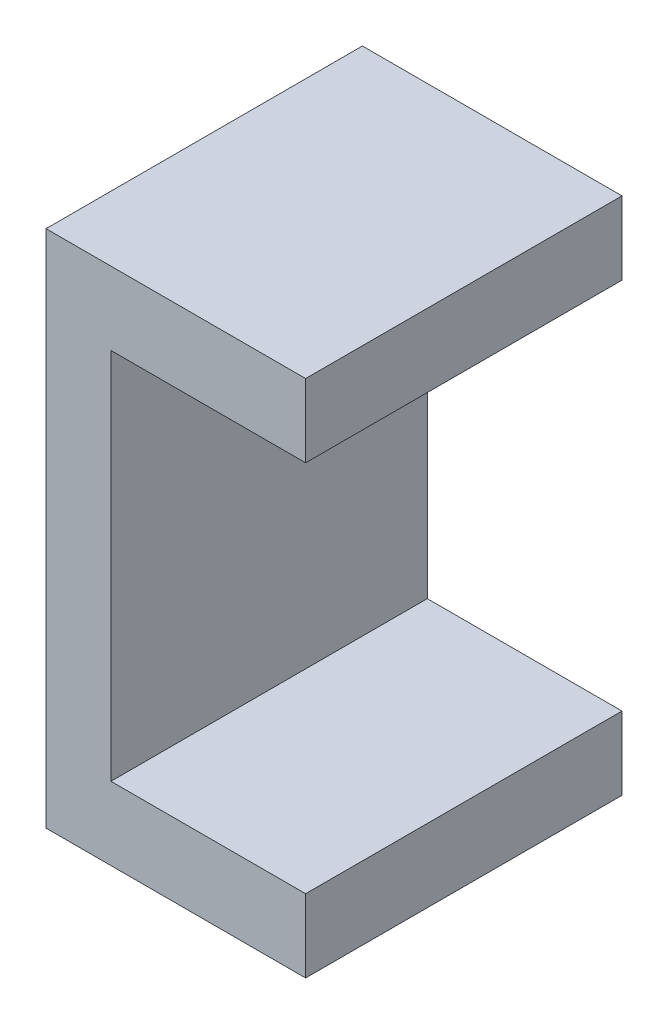
ISO-10303-21;
HEADER;
FILE_DESCRIPTION(('STEP AP214'),'2;1');
FILE_NAME('part.step','',(''),(''),'','','');
FILE_SCHEMA(('AUTOMOTIVE_DESIGN { 1 0 10303 214 1 1 1 1 }'));
ENDSEC;
DATA;
#1=APPLICATION_CONTEXT('core data for automotive mechanical design processes');
#2=APPLICATION_PROTOCOL_DEFINITION('international standard','automotive_design',2000,#1);
#3=PRODUCT_CONTEXT('',#1,'mechanical');
#4=PRODUCT('Part','Part','',(#3));
#5=PRODUCT_RELATED_PRODUCT_CATEGORY('part','',(#4));
#6=PRODUCT_DEFINITION_FORMATION('','',#4);
#7=PRODUCT_DEFINITION_CONTEXT('part definition',#1,'design');
#8=PRODUCT_DEFINITION('design','',#6,#7);
#9=PRODUCT_DEFINITION_SHAPE('','',#8);
#10=(LENGTH_UNIT() NAMED_UNIT(*) SI_UNIT(.MILLI.,.METRE.));
#11=(NAMED_UNIT(*) PLANE_ANGLE_UNIT() SI_UNIT($,.RADIAN.));
#12=(NAMED_UNIT(*) SI_UNIT($,.STERADIAN.) SOLID_ANGLE_UNIT());
#13=UNCERTAINTY_MEASURE_WITH_UNIT(LENGTH_MEASURE(1.E-05),#10,'distance_accuracy_value','');
#14=(GEOMETRIC_REPRESENTATION_CONTEXT(3) GLOBAL_UNCERTAINTY_ASSIGNED_CONTEXT((#13)) GLOBAL_UNIT_ASSIGNED_CONTEXT((#10,
#11,#12)) REPRESENTATION_CONTEXT('',''));
#15=CARTESIAN_POINT('',(0.,0.,0.));
#16=DIRECTION('',(0.,0.,1.));
#17=DIRECTION('',(1.,0.,0.));
#18=AXIS2_PLACEMENT_3D('',#15,#16,#17);
#19=CARTESIAN_POINT('',(-10.,-16.,19.5));
#20=DIRECTION('',(1.,0.,0.));
#21=DIRECTION('',(0.,0.,-1.));
#22=AXIS2_PLACEMENT_3D('',#19,#20,#21);
#23=PLANE('',#22);
#24=DIRECTION('',(0.,-1.,0.));
#25=VECTOR('',#24,1.);
#26=CARTESIAN_POINT('',(-10.,-16.,0.));
#27=LINE('',#26,#25);
#28=CARTESIAN_POINT('',(-10.,16.,0.));
#29=VERTEX_POINT('',#28);
#30=CARTESIAN_POINT('',(-10.,-16.,0.));
#31=VERTEX_POINT('',#30);
#32=EDGE_CURVE('E147',#29,#31,#27,.T.);
#33=ORIENTED_EDGE('',*,*,#32,.T.);
#34=DIRECTION('',(0.,0.,-1.));
#35=VECTOR('',#34,1.);
#36=CARTESIAN_POINT('',(-10.,-16.,19.5));
#37=LINE('',#36,#35);
#38=CARTESIAN_POINT('',(-10.,-16.,19.5));
#39=VERTEX_POINT('',#38);
#40=EDGE_CURVE('E11',#39,#31,#37,.T.);
#41=ORIENTED_EDGE('',*,*,#40,.F.);
#42=DIRECTION('',(0.,-1.,0.));
#43=VECTOR('',#42,1.);
#44=CARTESIAN_POINT('',(-10.,-16.,19.5));
#45=LINE('',#44,#43);
#46=CARTESIAN_POINT('',(-10.,16.,19.5));
#47=VERTEX_POINT('',#46);
#48=EDGE_CURVE('E170',#47,#39,#45,.T.);
#49=ORIENTED_EDGE('',*,*,#48,.F.);
#50=DIRECTION('',(0.,0.,-1.));
#51=VECTOR('',#50,1.);
#52=CARTESIAN_POINT('',(-10.,16.,19.5));
#53=LINE('',#52,#51);
#54=EDGE_CURVE('E143',#47,#29,#53,.T.);
#55=ORIENTED_EDGE('',*,*,#54,.T.);
#56=EDGE_LOOP('',(#33,#41,#49,#55));
#57=FACE_BOUND('',#56,.T.);
#58=ADVANCED_FACE('F45',(#57),#23,.F.);
#59=CARTESIAN_POINT('',(-6.,-16.,19.5));
#60=DIRECTION('',(0.,1.,0.));
#61=DIRECTION('',(0.,0.,1.));
#62=AXIS2_PLACEMENT_3D('',#59,#60,#61);
#63=PLANE('',#62);
#64=DIRECTION('',(1.,0.,0.));
#65=VECTOR('',#64,1.);
#66=CARTESIAN_POINT('',(-6.,-16.,0.));
#67=LINE('',#66,#65);
#68=CARTESIAN_POINT('',(6.,-16.,0.));
#69=VERTEX_POINT('',#68);
#70=EDGE_CURVE('E151',#31,#69,#67,.T.);
#71=ORIENTED_EDGE('',*,*,#70,.T.);
#72=DIRECTION('',(0.,0.,-1.));
#73=VECTOR('',#72,1.);
#74=CARTESIAN_POINT('',(6.,-16.,19.5));
#75=LINE('',#74,#73);
#76=CARTESIAN_POINT('',(6.,-16.,19.5));
#77=VERTEX_POINT('',#76);
#78=EDGE_CURVE('E54',#77,#69,#75,.T.);
#79=ORIENTED_EDGE('',*,*,#78,.F.);
#80=DIRECTION('',(1.,0.,0.));
#81=VECTOR('',#80,1.);
#82=CARTESIAN_POINT('',(-10.,-16.,19.5));
#83=LINE('',#82,#81);
#84=EDGE_CURVE('E103',#39,#77,#83,.T.);
#85=ORIENTED_EDGE('',*,*,#84,.F.);
#86=ORIENTED_EDGE('',*,*,#40,.T.);
#87=EDGE_LOOP('',(#71,#79,#85,#86));
#88=FACE_BOUND('',#87,.T.);
#89=ADVANCED_FACE('F214',(#88),#63,.F.);
#90=CARTESIAN_POINT('',(6.,-16.,19.5));
#91=DIRECTION('',(-1.,0.,0.));
#92=DIRECTION('',(0.,0.,1.));
#93=AXIS2_PLACEMENT_3D('',#90,#91,#92);
#94=PLANE('',#93);
#95=DIRECTION('',(0.,1.,0.));
#96=VECTOR('',#95,1.);
#97=CARTESIAN_POINT('',(6.,-16.,0.));
#98=LINE('',#97,#96);
#99=CARTESIAN_POINT('',(6.,-11.5,0.));
#100=VERTEX_POINT('',#99);
#101=EDGE_CURVE('E154',#69,#100,#98,.T.);
#102=ORIENTED_EDGE('',*,*,#101,.T.);
#103=DIRECTION('',(0.,0.,-1.));
#104=VECTOR('',#103,1.);
#105=CARTESIAN_POINT('',(6.,-11.5,19.5));
#106=LINE('',#105,#104);
#107=CARTESIAN_POINT('',(6.,-11.5,19.5));
#108=VERTEX_POINT('',#107);
#109=EDGE_CURVE('E181',#108,#100,#106,.T.);
#110=ORIENTED_EDGE('',*,*,#109,.F.);
#111=DIRECTION('',(0.,1.,0.));
#112=VECTOR('',#111,1.);
#113=CARTESIAN_POINT('',(6.,-16.,19.5));
#114=LINE('',#113,#112);
#115=EDGE_CURVE('E191',#77,#108,#114,.T.);
#116=ORIENTED_EDGE('',*,*,#115,.F.);
#117=ORIENTED_EDGE('',*,*,#78,.T.);
#118=EDGE_LOOP('',(#102,#110,#116,#117));
#119=FACE_BOUND('',#118,.T.);
#120=ADVANCED_FACE('F189',(#119),#94,.F.);
#121=CARTESIAN_POINT('',(-6.,-11.5,19.5));
#122=DIRECTION('',(0.,-1.,0.));
#123=DIRECTION('',(1.,0.,0.));
#124=AXIS2_PLACEMENT_3D('',#121,#122,#123);
#125=PLANE('',#124);
#126=DIRECTION('',(-1.,0.,0.));
#127=VECTOR('',#126,1.);
#128=CARTESIAN_POINT('',(-6.,-11.5,0.));
#129=LINE('',#128,#127);
#130=CARTESIAN_POINT('',(-6.,-11.5,0.));
#131=VERTEX_POINT('',#130);
#132=EDGE_CURVE('E157',#100,#131,#129,.T.);
#133=ORIENTED_EDGE('',*,*,#132,.T.);
#134=DIRECTION('',(0.,0.,-1.));
#135=VECTOR('',#134,1.);
#136=CARTESIAN_POINT('',(-6.,-11.5,19.5));
#137=LINE('',#136,#135);
#138=CARTESIAN_POINT('',(-6.,-11.5,19.5));
#139=VERTEX_POINT('',#138);
#140=EDGE_CURVE('E177',#139,#131,#137,.T.);
#141=ORIENTED_EDGE('',*,*,#140,.F.);
#142=DIRECTION('',(-1.,0.,0.));
#143=VECTOR('',#142,1.);
#144=CARTESIAN_POINT('',(-6.,-11.5,19.5));
#145=LINE('',#144,#143);
#146=EDGE_CURVE('E202',#108,#139,#145,.T.);
#147=ORIENTED_EDGE('',*,*,#146,.F.);
#148=ORIENTED_EDGE('',*,*,#109,.T.);
#149=EDGE_LOOP('',(#133,#141,#147,#148));
#150=FACE_BOUND('',#149,.T.);
#151=ADVANCED_FACE('F197',(#150),#125,.F.);
#152=CARTESIAN_POINT('',(-6.,-11.5,19.5));
#153=DIRECTION('',(-1.,0.,0.));
#154=DIRECTION('',(0.,0.,1.));
#155=AXIS2_PLACEMENT_3D('',#152,#153,#154);
#156=PLANE('',#155);
#157=DIRECTION('',(0.,1.,0.));
#158=VECTOR('',#157,1.);
#159=CARTESIAN_POINT('',(-6.,-11.5,0.));
#160=LINE('',#159,#158);
#161=CARTESIAN_POINT('',(-6.,11.5,0.));
#162=VERTEX_POINT('',#161);
#163=EDGE_CURVE('E160',#131,#162,#160,.T.);
#164=ORIENTED_EDGE('',*,*,#163,.T.);
#165=DIRECTION('',(0.,0.,-1.));
#166=VECTOR('',#165,1.);
#167=CARTESIAN_POINT('',(-6.,11.5,19.5));
#168=LINE('',#167,#166);
#169=CARTESIAN_POINT('',(-6.,11.5,19.5));
#170=VERTEX_POINT('',#169);
#171=EDGE_CURVE('E136',#170,#162,#168,.T.);
#172=ORIENTED_EDGE('',*,*,#171,.F.);
#173=DIRECTION('',(0.,1.,0.));
#174=VECTOR('',#173,1.);
#175=CARTESIAN_POINT('',(-6.,-11.5,19.5));
#176=LINE('',#175,#174);
#177=EDGE_CURVE('E123',#139,#170,#176,.T.);
#178=ORIENTED_EDGE('',*,*,#177,.F.);
#179=ORIENTED_EDGE('',*,*,#140,.T.);
#180=EDGE_LOOP('',(#164,#172,#178,#179));
#181=FACE_BOUND('',#180,.T.);
#182=ADVANCED_FACE('F200',(#181),#156,.F.);
#183=CARTESIAN_POINT('',(-6.,11.5,19.5));
#184=DIRECTION('',(0.,1.,0.));
#185=DIRECTION('',(0.,0.,1.));
#186=AXIS2_PLACEMENT_3D('',#183,#184,#185);
#187=PLANE('',#186);
#188=DIRECTION('',(1.,0.,0.));
#189=VECTOR('',#188,1.);
#190=CARTESIAN_POINT('',(-6.,11.5,0.));
#191=LINE('',#190,#189);
#192=CARTESIAN_POINT('',(6.,11.5,0.));
#193=VERTEX_POINT('',#192);
#194=EDGE_CURVE('E133',#162,#193,#191,.T.);
#195=ORIENTED_EDGE('',*,*,#194,.T.);
#196=DIRECTION('',(0.,0.,-1.));
#197=VECTOR('',#196,1.);
#198=CARTESIAN_POINT('',(6.,11.5,19.5));
#199=LINE('',#198,#197);
#200=CARTESIAN_POINT('',(6.,11.5,19.5));
#201=VERTEX_POINT('',#200);
#202=EDGE_CURVE('E130',#201,#193,#199,.T.);
#203=ORIENTED_EDGE('',*,*,#202,.F.);
#204=DIRECTION('',(1.,0.,0.));
#205=VECTOR('',#204,1.);
#206=CARTESIAN_POINT('',(-6.,11.5,19.5));
#207=LINE('',#206,#205);
#208=EDGE_CURVE('E116',#170,#201,#207,.T.);
#209=ORIENTED_EDGE('',*,*,#208,.F.);
#210=ORIENTED_EDGE('',*,*,#171,.T.);
#211=EDGE_LOOP('',(#195,#203,#209,#210));
#212=FACE_BOUND('',#211,.T.);
#213=ADVANCED_FACE('F131',(#212),#187,.F.);
#214=CARTESIAN_POINT('',(6.,16.,19.5));
#215=DIRECTION('',(-1.,0.,0.));
#216=DIRECTION('',(0.,0.,1.));
#217=AXIS2_PLACEMENT_3D('',#214,#215,#216);
#218=PLANE('',#217);
#219=DIRECTION('',(0.,1.,0.));
#220=VECTOR('',#219,1.);
#221=CARTESIAN_POINT('',(6.,16.,0.));
#222=LINE('',#221,#220);
#223=CARTESIAN_POINT('',(6.,16.,0.));
#224=VERTEX_POINT('',#223);
#225=EDGE_CURVE('E165',#193,#224,#222,.T.);
#226=ORIENTED_EDGE('',*,*,#225,.T.);
#227=DIRECTION('',(0.,0.,-1.));
#228=VECTOR('',#227,1.);
#229=CARTESIAN_POINT('',(6.,16.,19.5));
#230=LINE('',#229,#228);
#231=CARTESIAN_POINT('',(6.,16.,19.5));
#232=VERTEX_POINT('',#231);
#233=EDGE_CURVE('E137',#232,#224,#230,.T.);
#234=ORIENTED_EDGE('',*,*,#233,.F.);
#235=DIRECTION('',(0.,1.,0.));
#236=VECTOR('',#235,1.);
#237=CARTESIAN_POINT('',(6.,16.,19.5));
#238=LINE('',#237,#236);
#239=EDGE_CURVE('E120',#201,#232,#238,.T.);
#240=ORIENTED_EDGE('',*,*,#239,.F.);
#241=ORIENTED_EDGE('',*,*,#202,.T.);
#242=EDGE_LOOP('',(#226,#234,#240,#241));
#243=FACE_BOUND('',#242,.T.);
#244=ADVANCED_FACE('F139',(#243),#218,.F.);
#245=CARTESIAN_POINT('',(-10.,16.,19.5));
#246=DIRECTION('',(0.,-1.,0.));
#247=DIRECTION('',(0.,0.,-1.));
#248=AXIS2_PLACEMENT_3D('',#245,#246,#247);
#249=PLANE('',#248);
#250=DIRECTION('',(-1.,0.,0.));
#251=VECTOR('',#250,1.);
#252=CARTESIAN_POINT('',(-10.,16.,0.));
#253=LINE('',#252,#251);
#254=EDGE_CURVE('E91',#224,#29,#253,.T.);
#255=ORIENTED_EDGE('',*,*,#254,.T.);
#256=ORIENTED_EDGE('',*,*,#54,.F.);
#257=DIRECTION('',(-1.,0.,0.));
#258=VECTOR('',#257,1.);
#259=CARTESIAN_POINT('',(-6.,16.,19.5));
#260=LINE('',#259,#258);
#261=EDGE_CURVE('E62',#232,#47,#260,.T.);
#262=ORIENTED_EDGE('',*,*,#261,.F.);
#263=ORIENTED_EDGE('',*,*,#233,.T.);
#264=EDGE_LOOP('',(#255,#256,#262,#263));
#265=FACE_BOUND('',#264,.T.);
#266=ADVANCED_FACE('F230',(#265),#249,.F.);
#267=CARTESIAN_POINT('',(0.,0.,19.5));
#268=DIRECTION('',(0.,0.,-1.));
#269=DIRECTION('',(-1.,0.,0.));
#270=AXIS2_PLACEMENT_3D('',#267,#268,#269);
#271=PLANE('',#270);
#272=ORIENTED_EDGE('',*,*,#48,.T.);
#273=ORIENTED_EDGE('',*,*,#84,.T.);
#274=ORIENTED_EDGE('',*,*,#115,.T.);
#275=ORIENTED_EDGE('',*,*,#146,.T.);
#276=ORIENTED_EDGE('',*,*,#177,.T.);
#277=ORIENTED_EDGE('',*,*,#208,.T.);
#278=ORIENTED_EDGE('',*,*,#239,.T.);
#279=ORIENTED_EDGE('',*,*,#261,.T.);
#280=EDGE_LOOP('',(#272,#273,#274,#275,#276,#277,#278,#279));
#281=FACE_BOUND('',#280,.T.);
#282=ADVANCED_FACE('F118',(#281),#271,.F.);
#283=CARTESIAN_POINT('',(0.,0.,0.));
#284=DIRECTION('',(0.,0.,-1.));
#285=DIRECTION('',(-1.,0.,0.));
#286=AXIS2_PLACEMENT_3D('',#283,#284,#285);
#287=PLANE('',#286);
#288=ORIENTED_EDGE('',*,*,#32,.F.);
#289=ORIENTED_EDGE('',*,*,#254,.F.);
#290=ORIENTED_EDGE('',*,*,#225,.F.);
#291=ORIENTED_EDGE('',*,*,#194,.F.);
#292=ORIENTED_EDGE('',*,*,#163,.F.);
#293=ORIENTED_EDGE('',*,*,#132,.F.);
#294=ORIENTED_EDGE('',*,*,#101,.F.);
#295=ORIENTED_EDGE('',*,*,#70,.F.);
#296=EDGE_LOOP('',(#288,#289,#290,#291,#292,#293,#294,#295));
#297=FACE_BOUND('',#296,.T.);
#298=ADVANCED_FACE('F193',(#297),#287,.T.);
#299=CLOSED_SHELL('',(#58,#89,#120,#151,#182,#213,#244,#266,#282,#298));
#300=MANIFOLD_SOLID_BREP('B2',#299);
#301=ADVANCED_BREP_SHAPE_REPRESENTATION('',(#18,#300),#14);
#302=SHAPE_DEFINITION_REPRESENTATION(#9,#301);
ENDSEC;
END-ISO-10303-21;
